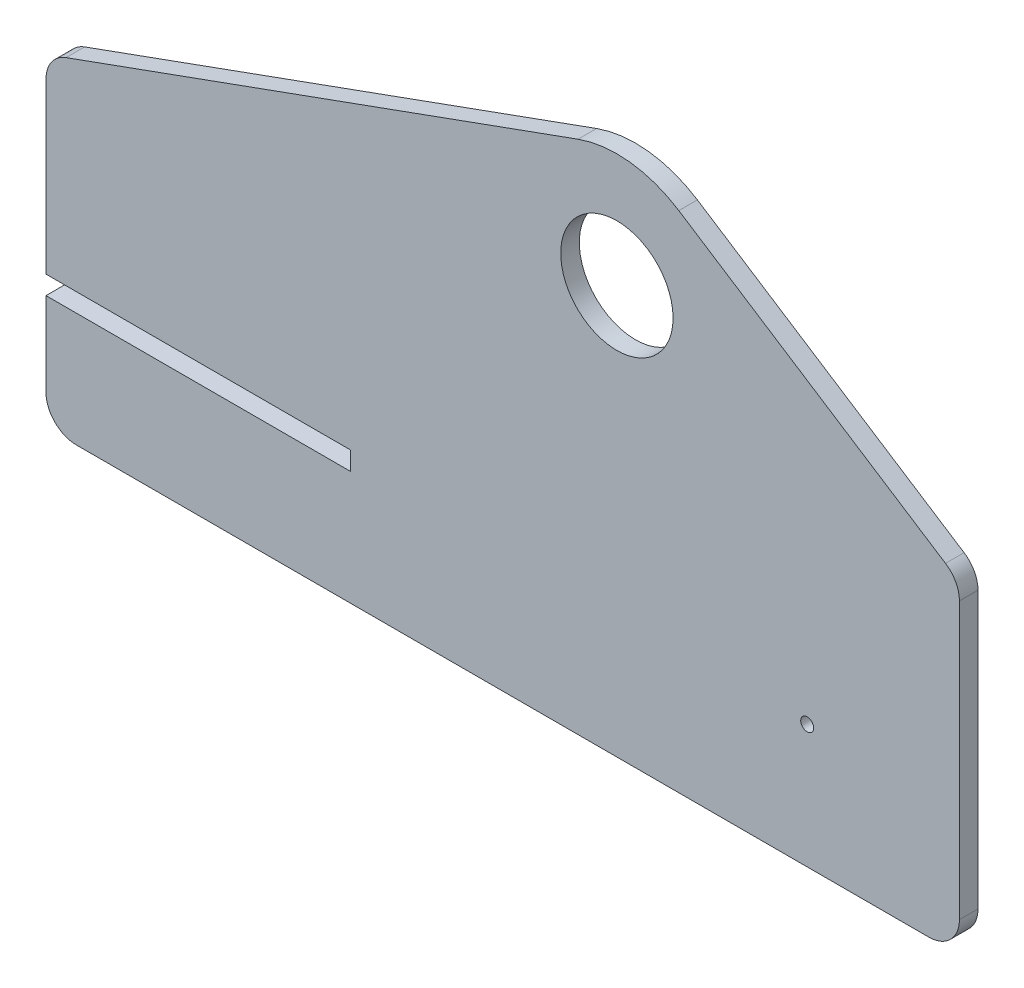
ISO-10303-21;
HEADER;
FILE_DESCRIPTION(('STEP AP214'),'2;1');
FILE_NAME('part.step','',(''),(''),'','','');
FILE_SCHEMA(('AUTOMOTIVE_DESIGN { 1 0 10303 214 1 1 1 1 }'));
ENDSEC;
DATA;
#1=APPLICATION_CONTEXT('core data for automotive mechanical design processes');
#2=APPLICATION_PROTOCOL_DEFINITION('international standard','automotive_design',2000,#1);
#3=PRODUCT_CONTEXT('',#1,'mechanical');
#4=PRODUCT('Part','Part','',(#3));
#5=PRODUCT_RELATED_PRODUCT_CATEGORY('part','',(#4));
#6=PRODUCT_DEFINITION_FORMATION('','',#4);
#7=PRODUCT_DEFINITION_CONTEXT('part definition',#1,'design');
#8=PRODUCT_DEFINITION('design','',#6,#7);
#9=PRODUCT_DEFINITION_SHAPE('','',#8);
#10=(LENGTH_UNIT() NAMED_UNIT(*) SI_UNIT(.MILLI.,.METRE.));
#11=(NAMED_UNIT(*) PLANE_ANGLE_UNIT() SI_UNIT($,.RADIAN.));
#12=(NAMED_UNIT(*) SI_UNIT($,.STERADIAN.) SOLID_ANGLE_UNIT());
#13=UNCERTAINTY_MEASURE_WITH_UNIT(LENGTH_MEASURE(1.E-05),#10,'distance_accuracy_value','');
#14=(GEOMETRIC_REPRESENTATION_CONTEXT(3) GLOBAL_UNCERTAINTY_ASSIGNED_CONTEXT((#13)) GLOBAL_UNIT_ASSIGNED_CONTEXT((#10,
#11,#12)) REPRESENTATION_CONTEXT('',''));
#15=CARTESIAN_POINT('',(0.,0.,0.));
#16=DIRECTION('',(0.,0.,1.));
#17=DIRECTION('',(1.,0.,0.));
#18=AXIS2_PLACEMENT_3D('',#15,#16,#17);
#19=CARTESIAN_POINT('',(-50.8,1.5494,3.0988));
#20=DIRECTION('',(1.,0.,0.));
#21=DIRECTION('',(0.,0.,-1.));
#22=AXIS2_PLACEMENT_3D('',#19,#20,#21);
#23=PLANE('',#22);
#24=DIRECTION('',(0.,-1.,0.));
#25=VECTOR('',#24,1.);
#26=CARTESIAN_POINT('',(-50.8,1.5494,3.0988));
#27=LINE('',#26,#25);
#28=CARTESIAN_POINT('',(-50.8,29.735711509026,3.0988));
#29=VERTEX_POINT('',#28);
#30=CARTESIAN_POINT('',(-50.8,1.5494,3.0988));
#31=VERTEX_POINT('',#30);
#32=EDGE_CURVE('E194',#29,#31,#27,.T.);
#33=ORIENTED_EDGE('',*,*,#32,.F.);
#34=DIRECTION('',(0.,0.,-1.));
#35=VECTOR('',#34,1.);
#36=CARTESIAN_POINT('',(-50.8,29.735711509026,3.0988));
#37=LINE('',#36,#35);
#38=CARTESIAN_POINT('',(-50.8,29.735711509026,0.));
#39=VERTEX_POINT('',#38);
#40=EDGE_CURVE('E42',#29,#39,#37,.T.);
#41=ORIENTED_EDGE('',*,*,#40,.T.);
#42=DIRECTION('',(0.,-1.,0.));
#43=VECTOR('',#42,1.);
#44=CARTESIAN_POINT('',(-50.8,1.5494,0.));
#45=LINE('',#44,#43);
#46=CARTESIAN_POINT('',(-50.8,1.5494,0.));
#47=VERTEX_POINT('',#46);
#48=EDGE_CURVE('E148',#39,#47,#45,.T.);
#49=ORIENTED_EDGE('',*,*,#48,.T.);
#50=DIRECTION('',(0.,0.,-1.));
#51=VECTOR('',#50,1.);
#52=CARTESIAN_POINT('',(-50.8,1.5494,3.0988));
#53=LINE('',#52,#51);
#54=EDGE_CURVE('E223',#31,#47,#53,.T.);
#55=ORIENTED_EDGE('',*,*,#54,.F.);
#56=EDGE_LOOP('',(#33,#41,#49,#55));
#57=FACE_BOUND('',#56,.T.);
#58=ADVANCED_FACE('F34',(#57),#23,.F.);
#59=CARTESIAN_POINT('',(-50.8,1.5494,3.0988));
#60=DIRECTION('',(0.,1.,0.));
#61=DIRECTION('',(-1.,0.,0.));
#62=AXIS2_PLACEMENT_3D('',#59,#60,#61);
#63=PLANE('',#62);
#64=DIRECTION('',(1.,0.,0.));
#65=VECTOR('',#64,1.);
#66=CARTESIAN_POINT('',(-50.8,1.5494,0.));
#67=LINE('',#66,#65);
#68=CARTESIAN_POINT('',(0.,1.5494,0.));
#69=VERTEX_POINT('',#68);
#70=EDGE_CURVE('E207',#47,#69,#67,.T.);
#71=ORIENTED_EDGE('',*,*,#70,.T.);
#72=DIRECTION('',(0.,0.,-1.));
#73=VECTOR('',#72,1.);
#74=CARTESIAN_POINT('',(0.,1.5494,3.0988));
#75=LINE('',#74,#73);
#76=CARTESIAN_POINT('',(0.,1.5494,3.0988));
#77=VERTEX_POINT('',#76);
#78=EDGE_CURVE('E220',#77,#69,#75,.T.);
#79=ORIENTED_EDGE('',*,*,#78,.F.);
#80=DIRECTION('',(1.,0.,0.));
#81=VECTOR('',#80,1.);
#82=CARTESIAN_POINT('',(-50.8,1.5494,3.0988));
#83=LINE('',#82,#81);
#84=EDGE_CURVE('E196',#31,#77,#83,.T.);
#85=ORIENTED_EDGE('',*,*,#84,.F.);
#86=ORIENTED_EDGE('',*,*,#54,.T.);
#87=EDGE_LOOP('',(#71,#79,#85,#86));
#88=FACE_BOUND('',#87,.T.);
#89=ADVANCED_FACE('F268',(#88),#63,.F.);
#90=CARTESIAN_POINT('',(0.,1.5494,3.0988));
#91=DIRECTION('',(1.,0.,0.));
#92=DIRECTION('',(0.,1.,0.));
#93=AXIS2_PLACEMENT_3D('',#90,#91,#92);
#94=PLANE('',#93);
#95=DIRECTION('',(0.,-1.,0.));
#96=VECTOR('',#95,1.);
#97=CARTESIAN_POINT('',(0.,1.5494,0.));
#98=LINE('',#97,#96);
#99=CARTESIAN_POINT('',(0.,-1.5494,0.));
#100=VERTEX_POINT('',#99);
#101=EDGE_CURVE('E209',#69,#100,#98,.T.);
#102=ORIENTED_EDGE('',*,*,#101,.T.);
#103=DIRECTION('',(0.,0.,-1.));
#104=VECTOR('',#103,1.);
#105=CARTESIAN_POINT('',(0.,-1.5494,3.0988));
#106=LINE('',#105,#104);
#107=CARTESIAN_POINT('',(0.,-1.5494,3.0988));
#108=VERTEX_POINT('',#107);
#109=EDGE_CURVE('E217',#108,#100,#106,.T.);
#110=ORIENTED_EDGE('',*,*,#109,.F.);
#111=DIRECTION('',(0.,-1.,0.));
#112=VECTOR('',#111,1.);
#113=CARTESIAN_POINT('',(0.,1.5494,3.0988));
#114=LINE('',#113,#112);
#115=EDGE_CURVE('E199',#77,#108,#114,.T.);
#116=ORIENTED_EDGE('',*,*,#115,.F.);
#117=ORIENTED_EDGE('',*,*,#78,.T.);
#118=EDGE_LOOP('',(#102,#110,#116,#117));
#119=FACE_BOUND('',#118,.T.);
#120=ADVANCED_FACE('F272',(#119),#94,.F.);
#121=CARTESIAN_POINT('',(-50.8,-1.5494,3.0988));
#122=DIRECTION('',(0.,-1.,0.));
#123=DIRECTION('',(1.,0.,0.));
#124=AXIS2_PLACEMENT_3D('',#121,#122,#123);
#125=PLANE('',#124);
#126=DIRECTION('',(-1.,0.,0.));
#127=VECTOR('',#126,1.);
#128=CARTESIAN_POINT('',(-50.8,-1.5494,0.));
#129=LINE('',#128,#127);
#130=CARTESIAN_POINT('',(-50.8,-1.5494,0.));
#131=VERTEX_POINT('',#130);
#132=EDGE_CURVE('E211',#100,#131,#129,.T.);
#133=ORIENTED_EDGE('',*,*,#132,.T.);
#134=DIRECTION('',(0.,0.,-1.));
#135=VECTOR('',#134,1.);
#136=CARTESIAN_POINT('',(-50.8,-1.5494,3.0988));
#137=LINE('',#136,#135);
#138=CARTESIAN_POINT('',(-50.8,-1.5494,3.0988));
#139=VERTEX_POINT('',#138);
#140=EDGE_CURVE('E205',#139,#131,#137,.T.);
#141=ORIENTED_EDGE('',*,*,#140,.F.);
#142=DIRECTION('',(-1.,0.,0.));
#143=VECTOR('',#142,1.);
#144=CARTESIAN_POINT('',(-50.8,-1.5494,3.0988));
#145=LINE('',#144,#143);
#146=EDGE_CURVE('E201',#108,#139,#145,.T.);
#147=ORIENTED_EDGE('',*,*,#146,.F.);
#148=ORIENTED_EDGE('',*,*,#109,.T.);
#149=EDGE_LOOP('',(#133,#141,#147,#148));
#150=FACE_BOUND('',#149,.T.);
#151=ADVANCED_FACE('F308',(#150),#125,.F.);
#152=CARTESIAN_POINT('',(-50.8,-7.8994,3.0988));
#153=DIRECTION('',(1.,0.,0.));
#154=DIRECTION('',(0.,0.,-1.));
#155=AXIS2_PLACEMENT_3D('',#152,#153,#154);
#156=PLANE('',#155);
#157=DIRECTION('',(0.,-1.,0.));
#158=VECTOR('',#157,1.);
#159=CARTESIAN_POINT('',(-50.8,-7.8994,0.));
#160=LINE('',#159,#158);
#161=CARTESIAN_POINT('',(-50.8,-15.5194,0.));
#162=VERTEX_POINT('',#161);
#163=EDGE_CURVE('E197',#131,#162,#160,.T.);
#164=ORIENTED_EDGE('',*,*,#163,.T.);
#165=DIRECTION('',(0.,0.,-1.));
#166=VECTOR('',#165,1.);
#167=CARTESIAN_POINT('',(-50.8,-15.5194,3.0988));
#168=LINE('',#167,#166);
#169=CARTESIAN_POINT('',(-50.8,-15.5194,3.0988));
#170=VERTEX_POINT('',#169);
#171=EDGE_CURVE('E251',#162,#170,#168,.F.);
#172=ORIENTED_EDGE('',*,*,#171,.T.);
#173=DIRECTION('',(0.,-1.,0.));
#174=VECTOR('',#173,1.);
#175=CARTESIAN_POINT('',(-50.8,-7.8994,3.0988));
#176=LINE('',#175,#174);
#177=EDGE_CURVE('E203',#139,#170,#176,.T.);
#178=ORIENTED_EDGE('',*,*,#177,.F.);
#179=ORIENTED_EDGE('',*,*,#140,.T.);
#180=EDGE_LOOP('',(#164,#172,#178,#179));
#181=FACE_BOUND('',#180,.T.);
#182=ADVANCED_FACE('F311',(#181),#156,.F.);
#183=CARTESIAN_POINT('',(0.,0.,3.0988));
#184=DIRECTION('',(0.,0.,-1.));
#185=DIRECTION('',(-1.,0.,0.));
#186=AXIS2_PLACEMENT_3D('',#183,#184,#185);
#187=PLANE('',#186);
#188=DIRECTION('',(0.,1.,0.));
#189=VECTOR('',#188,1.);
#190=CARTESIAN_POINT('',(101.6,0.,3.0988));
#191=LINE('',#190,#189);
#192=CARTESIAN_POINT('',(101.6,-15.5194,3.0988));
#193=VERTEX_POINT('',#192);
#194=CARTESIAN_POINT('',(101.6,30.5322911765542,3.0988));
#195=VERTEX_POINT('',#194);
#196=EDGE_CURVE('E174',#193,#195,#191,.T.);
#197=ORIENTED_EDGE('',*,*,#196,.T.);
#198=CARTESIAN_POINT('',(96.52,30.5322911765542,3.0988));
#199=DIRECTION('',(0.,0.,-1.));
#200=DIRECTION('',(-1.,0.,0.));
#201=AXIS2_PLACEMENT_3D('',#198,#199,#200);
#202=CIRCLE('',#201,5.08);
#203=CARTESIAN_POINT('',(99.2752431658124,34.8001987548933,3.0988));
#204=VERTEX_POINT('',#203);
#205=EDGE_CURVE('E163',#195,#204,#202,.F.);
#206=ORIENTED_EDGE('',*,*,#205,.T.);
#207=DIRECTION('',(0.84013928707462,-0.542370701931576,0.));
#208=VECTOR('',#207,1.);
#209=CARTESIAN_POINT('',(45.0606989270529,69.7996100025961,3.0988));
#210=LINE('',#209,#208);
#211=CARTESIAN_POINT('',(54.7821618717965,63.5237022308005,3.0988));
#212=VERTEX_POINT('',#211);
#213=EDGE_CURVE('E141',#212,#204,#210,.T.);
#214=ORIENTED_EDGE('',*,*,#213,.F.);
#215=CARTESIAN_POINT('',(44.45,47.5190488120291,3.0988));
#216=DIRECTION('',(0.,0.,1.));
#217=DIRECTION('',(1.,0.,0.));
#218=AXIS2_PLACEMENT_3D('',#215,#216,#217);
#219=CIRCLE('',#218,19.05);
#220=CARTESIAN_POINT('',(37.9658806095995,65.4315778275263,3.0988));
#221=VERTEX_POINT('',#220);
#222=EDGE_CURVE('E153',#212,#221,#219,.T.);
#223=ORIENTED_EDGE('',*,*,#222,.T.);
#224=DIRECTION('',(-0.940290237033978,-0.340373721280868,0.));
#225=VECTOR('',#224,1.);
#226=CARTESIAN_POINT('',(-16.5428727921967,45.700066739764,3.0988));
#227=LINE('',#226,#225);
#228=CARTESIAN_POINT('',(-47.4490985041068,34.5123859131586,3.0988));
#229=VERTEX_POINT('',#228);
#230=EDGE_CURVE('E157',#221,#229,#227,.T.);
#231=ORIENTED_EDGE('',*,*,#230,.T.);
#232=CARTESIAN_POINT('',(-45.72,29.735711509026,3.0988));
#233=DIRECTION('',(0.,0.,-1.));
#234=DIRECTION('',(-1.,0.,0.));
#235=AXIS2_PLACEMENT_3D('',#232,#233,#234);
#236=CIRCLE('',#235,5.08);
#237=EDGE_CURVE('E241',#229,#29,#236,.F.);
#238=ORIENTED_EDGE('',*,*,#237,.T.);
#239=ORIENTED_EDGE('',*,*,#32,.T.);
#240=ORIENTED_EDGE('',*,*,#84,.T.);
#241=ORIENTED_EDGE('',*,*,#115,.T.);
#242=ORIENTED_EDGE('',*,*,#146,.T.);
#243=ORIENTED_EDGE('',*,*,#177,.T.);
#244=CARTESIAN_POINT('',(-45.72,-15.5194,3.0988));
#245=DIRECTION('',(0.,0.,-1.));
#246=DIRECTION('',(-1.,0.,0.));
#247=AXIS2_PLACEMENT_3D('',#244,#245,#246);
#248=CIRCLE('',#247,5.08);
#249=CARTESIAN_POINT('',(-45.72,-20.5994,3.0988));
#250=VERTEX_POINT('',#249);
#251=EDGE_CURVE('E56',#170,#250,#248,.F.);
#252=ORIENTED_EDGE('',*,*,#251,.T.);
#253=DIRECTION('',(1.,0.,0.));
#254=VECTOR('',#253,1.);
#255=CARTESIAN_POINT('',(0.,-20.5994,3.0988));
#256=LINE('',#255,#254);
#257=CARTESIAN_POINT('',(96.52,-20.5994,3.0988));
#258=VERTEX_POINT('',#257);
#259=EDGE_CURVE('E172',#250,#258,#256,.T.);
#260=ORIENTED_EDGE('',*,*,#259,.T.);
#261=CARTESIAN_POINT('',(96.52,-15.5194,3.0988));
#262=DIRECTION('',(0.,0.,-1.));
#263=DIRECTION('',(-1.,0.,0.));
#264=AXIS2_PLACEMENT_3D('',#261,#262,#263);
#265=CIRCLE('',#264,5.08);
#266=EDGE_CURVE('E244',#258,#193,#265,.F.);
#267=ORIENTED_EDGE('',*,*,#266,.T.);
#268=EDGE_LOOP('',(#197,#206,#214,#223,#231,#238,#239,#240,#241,#242,#243,#252,#260,#267));
#269=FACE_BOUND('',#268,.T.);
#270=CARTESIAN_POINT('',(76.2,0.,3.0988));
#271=DIRECTION('',(0.,0.,1.));
#272=DIRECTION('',(1.,0.,0.));
#273=AXIS2_PLACEMENT_3D('',#270,#271,#272);
#274=CIRCLE('',#273,1.0795);
#275=CARTESIAN_POINT('',(77.2795,0.,3.0988));
#276=VERTEX_POINT('',#275);
#277=EDGE_CURVE('E167',#276,#276,#274,.T.);
#278=ORIENTED_EDGE('',*,*,#277,.F.);
#279=EDGE_LOOP('',(#278));
#280=FACE_BOUND('',#279,.T.);
#281=CARTESIAN_POINT('',(44.45,47.5190488120291,3.0988));
#282=DIRECTION('',(0.,0.,1.));
#283=DIRECTION('',(1.,0.,0.));
#284=AXIS2_PLACEMENT_3D('',#281,#282,#283);
#285=CIRCLE('',#284,9.3726);
#286=CARTESIAN_POINT('',(53.8226,47.5190488120291,3.0988));
#287=VERTEX_POINT('',#286);
#288=EDGE_CURVE('E164',#287,#287,#285,.T.);
#289=ORIENTED_EDGE('',*,*,#288,.F.);
#290=EDGE_LOOP('',(#289));
#291=FACE_BOUND('',#290,.T.);
#292=ADVANCED_FACE('F160',(#269,#280,#291),#187,.F.);
#293=CARTESIAN_POINT('',(0.,0.,0.));
#294=DIRECTION('',(0.,0.,-1.));
#295=DIRECTION('',(-1.,0.,0.));
#296=AXIS2_PLACEMENT_3D('',#293,#294,#295);
#297=PLANE('',#296);
#298=DIRECTION('',(0.84013928707462,-0.542370701931576,0.));
#299=VECTOR('',#298,1.);
#300=CARTESIAN_POINT('',(45.0606989270529,69.7996100025961,0.));
#301=LINE('',#300,#299);
#302=CARTESIAN_POINT('',(54.7821618717965,63.5237022308005,0.));
#303=VERTEX_POINT('',#302);
#304=CARTESIAN_POINT('',(99.2752431658124,34.8001987548933,0.));
#305=VERTEX_POINT('',#304);
#306=EDGE_CURVE('E144',#303,#305,#301,.T.);
#307=ORIENTED_EDGE('',*,*,#306,.T.);
#308=CARTESIAN_POINT('',(96.52,30.5322911765542,0.));
#309=DIRECTION('',(0.,0.,-1.));
#310=DIRECTION('',(-1.,0.,0.));
#311=AXIS2_PLACEMENT_3D('',#308,#309,#310);
#312=CIRCLE('',#311,5.08);
#313=CARTESIAN_POINT('',(101.6,30.5322911765542,0.));
#314=VERTEX_POINT('',#313);
#315=EDGE_CURVE('E234',#305,#314,#312,.T.);
#316=ORIENTED_EDGE('',*,*,#315,.T.);
#317=DIRECTION('',(0.,1.,0.));
#318=VECTOR('',#317,1.);
#319=CARTESIAN_POINT('',(101.6,0.,0.));
#320=LINE('',#319,#318);
#321=CARTESIAN_POINT('',(101.6,-15.5194,0.));
#322=VERTEX_POINT('',#321);
#323=EDGE_CURVE('E190',#322,#314,#320,.T.);
#324=ORIENTED_EDGE('',*,*,#323,.F.);
#325=CARTESIAN_POINT('',(96.52,-15.5194,0.));
#326=DIRECTION('',(0.,0.,-1.));
#327=DIRECTION('',(-1.,0.,0.));
#328=AXIS2_PLACEMENT_3D('',#325,#326,#327);
#329=CIRCLE('',#328,5.08);
#330=CARTESIAN_POINT('',(96.52,-20.5994,0.));
#331=VERTEX_POINT('',#330);
#332=EDGE_CURVE('E232',#322,#331,#329,.T.);
#333=ORIENTED_EDGE('',*,*,#332,.T.);
#334=DIRECTION('',(1.,0.,0.));
#335=VECTOR('',#334,1.);
#336=CARTESIAN_POINT('',(0.,-20.5994,0.));
#337=LINE('',#336,#335);
#338=CARTESIAN_POINT('',(-45.72,-20.5994,0.));
#339=VERTEX_POINT('',#338);
#340=EDGE_CURVE('E188',#339,#331,#337,.T.);
#341=ORIENTED_EDGE('',*,*,#340,.F.);
#342=CARTESIAN_POINT('',(-45.72,-15.5194,0.));
#343=DIRECTION('',(0.,0.,-1.));
#344=DIRECTION('',(-1.,0.,0.));
#345=AXIS2_PLACEMENT_3D('',#342,#343,#344);
#346=CIRCLE('',#345,5.08);
#347=EDGE_CURVE('E230',#339,#162,#346,.T.);
#348=ORIENTED_EDGE('',*,*,#347,.T.);
#349=ORIENTED_EDGE('',*,*,#163,.F.);
#350=ORIENTED_EDGE('',*,*,#132,.F.);
#351=ORIENTED_EDGE('',*,*,#101,.F.);
#352=ORIENTED_EDGE('',*,*,#70,.F.);
#353=ORIENTED_EDGE('',*,*,#48,.F.);
#354=CARTESIAN_POINT('',(-45.72,29.735711509026,0.));
#355=DIRECTION('',(0.,0.,-1.));
#356=DIRECTION('',(-1.,0.,0.));
#357=AXIS2_PLACEMENT_3D('',#354,#355,#356);
#358=CIRCLE('',#357,5.08);
#359=CARTESIAN_POINT('',(-47.4490985041068,34.5123859131586,0.));
#360=VERTEX_POINT('',#359);
#361=EDGE_CURVE('E228',#39,#360,#358,.T.);
#362=ORIENTED_EDGE('',*,*,#361,.T.);
#363=DIRECTION('',(-0.940290237033978,-0.340373721280868,0.));
#364=VECTOR('',#363,1.);
#365=CARTESIAN_POINT('',(-16.5428727921967,45.700066739764,0.));
#366=LINE('',#365,#364);
#367=CARTESIAN_POINT('',(37.9658806095995,65.4315778275263,0.));
#368=VERTEX_POINT('',#367);
#369=EDGE_CURVE('E185',#368,#360,#366,.T.);
#370=ORIENTED_EDGE('',*,*,#369,.F.);
#371=CARTESIAN_POINT('',(44.45,47.5190488120291,0.));
#372=DIRECTION('',(0.,0.,1.));
#373=DIRECTION('',(1.,0.,0.));
#374=AXIS2_PLACEMENT_3D('',#371,#372,#373);
#375=CIRCLE('',#374,19.05);
#376=EDGE_CURVE('E183',#303,#368,#375,.T.);
#377=ORIENTED_EDGE('',*,*,#376,.F.);
#378=EDGE_LOOP('',(#307,#316,#324,#333,#341,#348,#349,#350,#351,#352,#353,#362,#370,#377));
#379=FACE_BOUND('',#378,.T.);
#380=CARTESIAN_POINT('',(76.2,0.,0.));
#381=DIRECTION('',(0.,0.,1.));
#382=DIRECTION('',(1.,0.,0.));
#383=AXIS2_PLACEMENT_3D('',#380,#381,#382);
#384=CIRCLE('',#383,1.0795);
#385=CARTESIAN_POINT('',(77.2795,0.,0.));
#386=VERTEX_POINT('',#385);
#387=EDGE_CURVE('E176',#386,#386,#384,.T.);
#388=ORIENTED_EDGE('',*,*,#387,.T.);
#389=EDGE_LOOP('',(#388));
#390=FACE_BOUND('',#389,.T.);
#391=CARTESIAN_POINT('',(44.45,47.5190488120291,0.));
#392=DIRECTION('',(0.,0.,1.));
#393=DIRECTION('',(1.,0.,0.));
#394=AXIS2_PLACEMENT_3D('',#391,#392,#393);
#395=CIRCLE('',#394,9.3726);
#396=CARTESIAN_POINT('',(53.8226,47.5190488120291,0.));
#397=VERTEX_POINT('',#396);
#398=EDGE_CURVE('E179',#397,#397,#395,.T.);
#399=ORIENTED_EDGE('',*,*,#398,.T.);
#400=EDGE_LOOP('',(#399));
#401=FACE_BOUND('',#400,.T.);
#402=ADVANCED_FACE('F262',(#379,#390,#401),#297,.T.);
#403=CARTESIAN_POINT('',(45.0606989270529,69.7996100025961,3.0988));
#404=DIRECTION('',(0.542370701931576,0.840139287074619,0.));
#405=DIRECTION('',(-0.840139287074619,0.542370701931576,0.));
#406=AXIS2_PLACEMENT_3D('',#403,#404,#405);
#407=PLANE('',#406);
#408=ORIENTED_EDGE('',*,*,#213,.T.);
#409=DIRECTION('',(0.,0.,-1.));
#410=VECTOR('',#409,1.);
#411=CARTESIAN_POINT('',(99.2752431658124,34.8001987548933,0.));
#412=LINE('',#411,#410);
#413=EDGE_CURVE('E226',#204,#305,#412,.T.);
#414=ORIENTED_EDGE('',*,*,#413,.T.);
#415=ORIENTED_EDGE('',*,*,#306,.F.);
#416=DIRECTION('',(0.,0.,-1.));
#417=VECTOR('',#416,1.);
#418=CARTESIAN_POINT('',(54.7821618717965,63.5237022308005,3.0988));
#419=LINE('',#418,#417);
#420=EDGE_CURVE('E136',#212,#303,#419,.T.);
#421=ORIENTED_EDGE('',*,*,#420,.F.);
#422=EDGE_LOOP('',(#408,#414,#415,#421));
#423=FACE_BOUND('',#422,.T.);
#424=ADVANCED_FACE('F138',(#423),#407,.T.);
#425=CARTESIAN_POINT('',(44.45,47.5190488120291,3.0988));
#426=DIRECTION('',(0.,0.,-1.));
#427=DIRECTION('',(-1.,0.,0.));
#428=AXIS2_PLACEMENT_3D('',#425,#426,#427);
#429=CYLINDRICAL_SURFACE('',#428,19.05);
#430=ORIENTED_EDGE('',*,*,#376,.T.);
#431=DIRECTION('',(0.,0.,-1.));
#432=VECTOR('',#431,1.);
#433=CARTESIAN_POINT('',(37.9658806095995,65.4315778275263,3.0988));
#434=LINE('',#433,#432);
#435=EDGE_CURVE('E149',#221,#368,#434,.T.);
#436=ORIENTED_EDGE('',*,*,#435,.F.);
#437=ORIENTED_EDGE('',*,*,#222,.F.);
#438=ORIENTED_EDGE('',*,*,#420,.T.);
#439=EDGE_LOOP('',(#430,#436,#437,#438));
#440=FACE_BOUND('',#439,.T.);
#441=ADVANCED_FACE('F154',(#440),#429,.T.);
#442=CARTESIAN_POINT('',(-16.5428727921967,45.700066739764,3.0988));
#443=DIRECTION('',(0.340373721280868,-0.940290237033977,0.));
#444=DIRECTION('',(0.940290237033978,0.340373721280868,0.));
#445=AXIS2_PLACEMENT_3D('',#442,#443,#444);
#446=PLANE('',#445);
#447=ORIENTED_EDGE('',*,*,#369,.T.);
#448=DIRECTION('',(0.,0.,-1.));
#449=VECTOR('',#448,1.);
#450=CARTESIAN_POINT('',(-47.4490985041068,34.5123859131586,3.0988));
#451=LINE('',#450,#449);
#452=EDGE_CURVE('E11',#360,#229,#451,.F.);
#453=ORIENTED_EDGE('',*,*,#452,.T.);
#454=ORIENTED_EDGE('',*,*,#230,.F.);
#455=ORIENTED_EDGE('',*,*,#435,.T.);
#456=EDGE_LOOP('',(#447,#453,#454,#455));
#457=FACE_BOUND('',#456,.T.);
#458=ADVANCED_FACE('F278',(#457),#446,.F.);
#459=CARTESIAN_POINT('',(0.,-20.5994,3.0988));
#460=DIRECTION('',(0.,1.,0.));
#461=DIRECTION('',(-1.,0.,0.));
#462=AXIS2_PLACEMENT_3D('',#459,#460,#461);
#463=PLANE('',#462);
#464=ORIENTED_EDGE('',*,*,#340,.T.);
#465=DIRECTION('',(0.,0.,-1.));
#466=VECTOR('',#465,1.);
#467=CARTESIAN_POINT('',(96.52,-20.5994,3.0988));
#468=LINE('',#467,#466);
#469=EDGE_CURVE('E49',#331,#258,#468,.F.);
#470=ORIENTED_EDGE('',*,*,#469,.T.);
#471=ORIENTED_EDGE('',*,*,#259,.F.);
#472=DIRECTION('',(0.,0.,-1.));
#473=VECTOR('',#472,1.);
#474=CARTESIAN_POINT('',(-45.72,-20.5994,3.0988));
#475=LINE('',#474,#473);
#476=EDGE_CURVE('E247',#250,#339,#475,.T.);
#477=ORIENTED_EDGE('',*,*,#476,.T.);
#478=EDGE_LOOP('',(#464,#470,#471,#477));
#479=FACE_BOUND('',#478,.T.);
#480=ADVANCED_FACE('F326',(#479),#463,.F.);
#481=CARTESIAN_POINT('',(44.45,47.5190488120291,3.0988));
#482=DIRECTION('',(0.,0.,-1.));
#483=DIRECTION('',(-1.,0.,0.));
#484=AXIS2_PLACEMENT_3D('',#481,#482,#483);
#485=CYLINDRICAL_SURFACE('',#484,9.3726);
#486=ORIENTED_EDGE('',*,*,#288,.T.);
#487=EDGE_LOOP('',(#486));
#488=FACE_BOUND('',#487,.T.);
#489=ORIENTED_EDGE('',*,*,#398,.F.);
#490=EDGE_LOOP('',(#489));
#491=FACE_BOUND('',#490,.T.);
#492=ADVANCED_FACE('F322',(#488,#491),#485,.F.);
#493=CARTESIAN_POINT('',(76.2,0.,3.0988));
#494=DIRECTION('',(0.,0.,-1.));
#495=DIRECTION('',(-1.,0.,0.));
#496=AXIS2_PLACEMENT_3D('',#493,#494,#495);
#497=CYLINDRICAL_SURFACE('',#496,1.0795);
#498=ORIENTED_EDGE('',*,*,#277,.T.);
#499=EDGE_LOOP('',(#498));
#500=FACE_BOUND('',#499,.T.);
#501=ORIENTED_EDGE('',*,*,#387,.F.);
#502=EDGE_LOOP('',(#501));
#503=FACE_BOUND('',#502,.T.);
#504=ADVANCED_FACE('F297',(#500,#503),#497,.F.);
#505=CARTESIAN_POINT('',(101.6,0.,3.0988));
#506=DIRECTION('',(-1.,0.,0.));
#507=DIRECTION('',(0.,0.,1.));
#508=AXIS2_PLACEMENT_3D('',#505,#506,#507);
#509=PLANE('',#508);
#510=ORIENTED_EDGE('',*,*,#323,.T.);
#511=DIRECTION('',(0.,0.,-1.));
#512=VECTOR('',#511,1.);
#513=CARTESIAN_POINT('',(101.6,30.5322911765542,3.0988));
#514=LINE('',#513,#512);
#515=EDGE_CURVE('E239',#314,#195,#514,.F.);
#516=ORIENTED_EDGE('',*,*,#515,.T.);
#517=ORIENTED_EDGE('',*,*,#196,.F.);
#518=DIRECTION('',(0.,0.,-1.));
#519=VECTOR('',#518,1.);
#520=CARTESIAN_POINT('',(101.6,-15.5194,3.0988));
#521=LINE('',#520,#519);
#522=EDGE_CURVE('E236',#193,#322,#521,.T.);
#523=ORIENTED_EDGE('',*,*,#522,.T.);
#524=EDGE_LOOP('',(#510,#516,#517,#523));
#525=FACE_BOUND('',#524,.T.);
#526=ADVANCED_FACE('F283',(#525),#509,.F.);
#527=CARTESIAN_POINT('',(96.52,30.5322911765542,3.0988));
#528=DIRECTION('',(0.,0.,1.));
#529=DIRECTION('',(1.,0.,0.));
#530=AXIS2_PLACEMENT_3D('',#527,#528,#529);
#531=CYLINDRICAL_SURFACE('',#530,5.08);
#532=ORIENTED_EDGE('',*,*,#205,.F.);
#533=ORIENTED_EDGE('',*,*,#515,.F.);
#534=ORIENTED_EDGE('',*,*,#315,.F.);
#535=ORIENTED_EDGE('',*,*,#413,.F.);
#536=EDGE_LOOP('',(#532,#533,#534,#535));
#537=FACE_BOUND('',#536,.T.);
#538=ADVANCED_FACE('F286',(#537),#531,.T.);
#539=CARTESIAN_POINT('',(96.52,-15.5194,3.0988));
#540=DIRECTION('',(0.,0.,-1.));
#541=DIRECTION('',(-1.,0.,0.));
#542=AXIS2_PLACEMENT_3D('',#539,#540,#541);
#543=CYLINDRICAL_SURFACE('',#542,5.08);
#544=ORIENTED_EDGE('',*,*,#266,.F.);
#545=ORIENTED_EDGE('',*,*,#469,.F.);
#546=ORIENTED_EDGE('',*,*,#332,.F.);
#547=ORIENTED_EDGE('',*,*,#522,.F.);
#548=EDGE_LOOP('',(#544,#545,#546,#547));
#549=FACE_BOUND('',#548,.T.);
#550=ADVANCED_FACE('F288',(#549),#543,.T.);
#551=CARTESIAN_POINT('',(-45.72,-15.5194,3.0988));
#552=DIRECTION('',(0.,0.,-1.));
#553=DIRECTION('',(-1.,0.,0.));
#554=AXIS2_PLACEMENT_3D('',#551,#552,#553);
#555=CYLINDRICAL_SURFACE('',#554,5.08);
#556=ORIENTED_EDGE('',*,*,#251,.F.);
#557=ORIENTED_EDGE('',*,*,#171,.F.);
#558=ORIENTED_EDGE('',*,*,#347,.F.);
#559=ORIENTED_EDGE('',*,*,#476,.F.);
#560=EDGE_LOOP('',(#556,#557,#558,#559));
#561=FACE_BOUND('',#560,.T.);
#562=ADVANCED_FACE('F294',(#561),#555,.T.);
#563=CARTESIAN_POINT('',(-45.72,29.735711509026,3.0988));
#564=DIRECTION('',(0.,0.,-1.));
#565=DIRECTION('',(-1.,0.,0.));
#566=AXIS2_PLACEMENT_3D('',#563,#564,#565);
#567=CYLINDRICAL_SURFACE('',#566,5.08);
#568=ORIENTED_EDGE('',*,*,#237,.F.);
#569=ORIENTED_EDGE('',*,*,#452,.F.);
#570=ORIENTED_EDGE('',*,*,#361,.F.);
#571=ORIENTED_EDGE('',*,*,#40,.F.);
#572=EDGE_LOOP('',(#568,#569,#570,#571));
#573=FACE_BOUND('',#572,.T.);
#574=ADVANCED_FACE('F36',(#573),#567,.T.);
#575=CLOSED_SHELL('',(#58,#89,#120,#151,#182,#292,#402,#424,#441,#458,#480,#492,#504,#526,#538,
#550,#562,#574));
#576=MANIFOLD_SOLID_BREP('B2',#575);
#577=ADVANCED_BREP_SHAPE_REPRESENTATION('',(#18,#576),#14);
#578=SHAPE_DEFINITION_REPRESENTATION(#9,#577);
ENDSEC;
END-ISO-10303-21;
